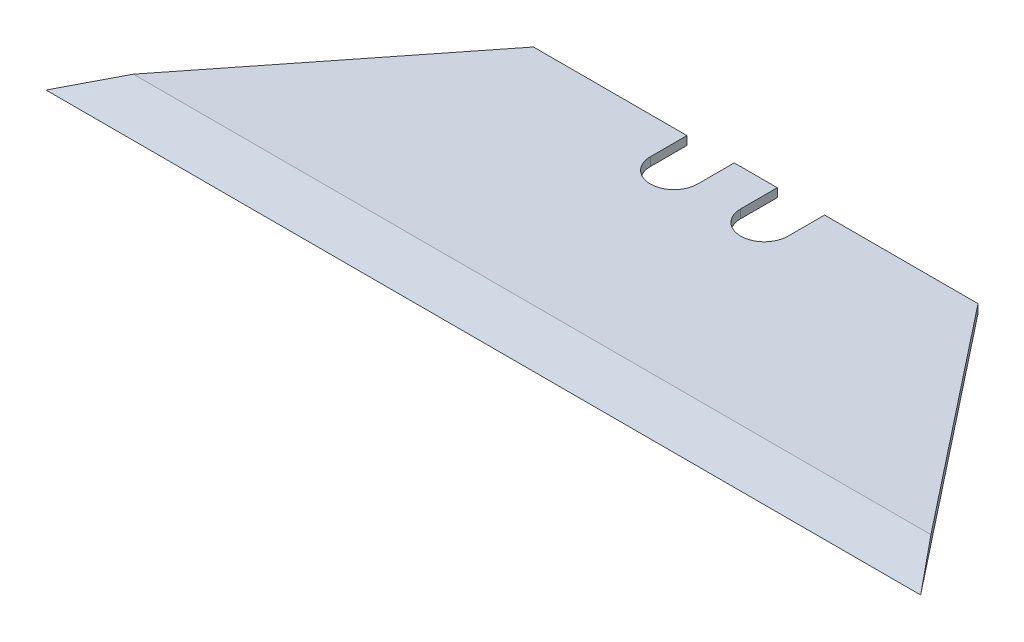
ISO-10303-21;
HEADER;
FILE_DESCRIPTION(('STEP AP214'),'2;1');
FILE_NAME('part.step','',(''),(''),'','','');
FILE_SCHEMA(('AUTOMOTIVE_DESIGN { 1 0 10303 214 1 1 1 1 }'));
ENDSEC;
DATA;
#1=APPLICATION_CONTEXT('core data for automotive mechanical design processes');
#2=APPLICATION_PROTOCOL_DEFINITION('international standard','automotive_design',2000,#1);
#3=PRODUCT_CONTEXT('',#1,'mechanical');
#4=PRODUCT('Part','Part','',(#3));
#5=PRODUCT_RELATED_PRODUCT_CATEGORY('part','',(#4));
#6=PRODUCT_DEFINITION_FORMATION('','',#4);
#7=PRODUCT_DEFINITION_CONTEXT('part definition',#1,'design');
#8=PRODUCT_DEFINITION('design','',#6,#7);
#9=PRODUCT_DEFINITION_SHAPE('','',#8);
#10=(LENGTH_UNIT() NAMED_UNIT(*) SI_UNIT(.MILLI.,.METRE.));
#11=(NAMED_UNIT(*) PLANE_ANGLE_UNIT() SI_UNIT($,.RADIAN.));
#12=(NAMED_UNIT(*) SI_UNIT($,.STERADIAN.) SOLID_ANGLE_UNIT());
#13=UNCERTAINTY_MEASURE_WITH_UNIT(LENGTH_MEASURE(1.E-05),#10,'distance_accuracy_value','');
#14=(GEOMETRIC_REPRESENTATION_CONTEXT(3) GLOBAL_UNCERTAINTY_ASSIGNED_CONTEXT((#13)) GLOBAL_UNIT_ASSIGNED_CONTEXT((#10,
#11,#12)) REPRESENTATION_CONTEXT('',''));
#15=CARTESIAN_POINT('',(0.,0.,0.));
#16=DIRECTION('',(0.,0.,1.));
#17=DIRECTION('',(1.,0.,0.));
#18=AXIS2_PLACEMENT_3D('',#15,#16,#17);
#19=CARTESIAN_POINT('',(46.,0.6,-19.));
#20=DIRECTION('',(0.,0.,1.));
#21=DIRECTION('',(1.,0.,0.));
#22=AXIS2_PLACEMENT_3D('',#19,#20,#21);
#23=PLANE('',#22);
#24=DIRECTION('',(-1.,0.,0.));
#25=VECTOR('',#24,1.);
#26=CARTESIAN_POINT('',(46.,0.6,-19.));
#27=LINE('',#26,#25);
#28=CARTESIAN_POINT('',(25.7,0.6,-19.));
#29=VERTEX_POINT('',#28);
#30=CARTESIAN_POINT('',(15.,0.6,-19.));
#31=VERTEX_POINT('',#30);
#32=EDGE_CURVE('E142',#29,#31,#27,.T.);
#33=ORIENTED_EDGE('',*,*,#32,.F.);
#34=DIRECTION('',(0.,-1.,0.));
#35=VECTOR('',#34,1.);
#36=CARTESIAN_POINT('',(25.7,0.6,-19.));
#37=LINE('',#36,#35);
#38=CARTESIAN_POINT('',(25.7,0.,-19.));
#39=VERTEX_POINT('',#38);
#40=EDGE_CURVE('E181',#29,#39,#37,.T.);
#41=ORIENTED_EDGE('',*,*,#40,.T.);
#42=DIRECTION('',(-1.,0.,0.));
#43=VECTOR('',#42,1.);
#44=CARTESIAN_POINT('',(46.,0.,-19.));
#45=LINE('',#44,#43);
#46=CARTESIAN_POINT('',(15.,0.,-19.));
#47=VERTEX_POINT('',#46);
#48=EDGE_CURVE('E158',#39,#47,#45,.T.);
#49=ORIENTED_EDGE('',*,*,#48,.T.);
#50=DIRECTION('',(0.,-1.,0.));
#51=VECTOR('',#50,1.);
#52=CARTESIAN_POINT('',(15.,0.6,-19.));
#53=LINE('',#52,#51);
#54=EDGE_CURVE('E151',#31,#47,#53,.T.);
#55=ORIENTED_EDGE('',*,*,#54,.F.);
#56=EDGE_LOOP('',(#33,#41,#49,#55));
#57=FACE_BOUND('',#56,.T.);
#58=ADVANCED_FACE('F40',(#57),#23,.F.);
#59=CARTESIAN_POINT('',(32.,0.,-19.));
#60=VERTEX_POINT('',#59);
#61=CARTESIAN_POINT('',(29.,0.,-19.));
#62=VERTEX_POINT('',#61);
#63=EDGE_CURVE('E161',#60,#62,#45,.T.);
#64=ORIENTED_EDGE('',*,*,#63,.T.);
#65=DIRECTION('',(0.,1.,0.));
#66=VECTOR('',#65,1.);
#67=CARTESIAN_POINT('',(29.,0.6,-19.));
#68=LINE('',#67,#66);
#69=CARTESIAN_POINT('',(29.,0.6,-19.));
#70=VERTEX_POINT('',#69);
#71=EDGE_CURVE('E60',#62,#70,#68,.T.);
#72=ORIENTED_EDGE('',*,*,#71,.T.);
#73=CARTESIAN_POINT('',(32.,0.6,-19.));
#74=VERTEX_POINT('',#73);
#75=EDGE_CURVE('E144',#74,#70,#27,.T.);
#76=ORIENTED_EDGE('',*,*,#75,.F.);
#77=DIRECTION('',(0.,-1.,0.));
#78=VECTOR('',#77,1.);
#79=CARTESIAN_POINT('',(32.,0.6,-19.));
#80=LINE('',#79,#78);
#81=EDGE_CURVE('E176',#74,#60,#80,.T.);
#82=ORIENTED_EDGE('',*,*,#81,.T.);
#83=EDGE_LOOP('',(#64,#72,#76,#82));
#84=FACE_BOUND('',#83,.T.);
#85=ADVANCED_FACE('F213',(#84),#23,.F.);
#86=CARTESIAN_POINT('',(15.,0.6,-19.));
#87=DIRECTION('',(0.784882765533426,0.,0.619644288579021));
#88=DIRECTION('',(0.619644288579021,0.,-0.784882765533426));
#89=AXIS2_PLACEMENT_3D('',#86,#87,#88);
#90=PLANE('',#89);
#91=DIRECTION('',(-0.619644288579021,0.,0.784882765533426));
#92=VECTOR('',#91,1.);
#93=CARTESIAN_POINT('',(15.,0.,-19.));
#94=LINE('',#93,#92);
#95=CARTESIAN_POINT('',(0.,0.,0.));
#96=VERTEX_POINT('',#95);
#97=EDGE_CURVE('E152',#47,#96,#94,.T.);
#98=ORIENTED_EDGE('',*,*,#97,.T.);
#99=DIRECTION('',(-0.613794030670308,-0.137089367726302,0.777472438849057));
#100=VECTOR('',#99,1.);
#101=CARTESIAN_POINT('',(1.67431521665146,0.373954132748098,-2.12079927442518));
#102=LINE('',#101,#100);
#103=CARTESIAN_POINT('',(2.68639665139785,0.6,-3.40276909177061));
#104=VERTEX_POINT('',#103);
#105=EDGE_CURVE('E126',#96,#104,#102,.F.);
#106=ORIENTED_EDGE('',*,*,#105,.T.);
#107=DIRECTION('',(-0.619644288579021,0.,0.784882765533426));
#108=VECTOR('',#107,1.);
#109=CARTESIAN_POINT('',(15.,0.6,-19.));
#110=LINE('',#109,#108);
#111=EDGE_CURVE('E136',#31,#104,#110,.T.);
#112=ORIENTED_EDGE('',*,*,#111,.F.);
#113=ORIENTED_EDGE('',*,*,#54,.T.);
#114=EDGE_LOOP('',(#98,#106,#112,#113));
#115=FACE_BOUND('',#114,.T.);
#116=ADVANCED_FACE('F254',(#115),#90,.F.);
#117=CARTESIAN_POINT('',(61.,0.6,0.));
#118=DIRECTION('',(-0.784882765533426,0.,0.619644288579021));
#119=DIRECTION('',(0.619644288579021,0.,0.784882765533426));
#120=AXIS2_PLACEMENT_3D('',#117,#118,#119);
#121=PLANE('',#120);
#122=DIRECTION('',(-0.619644288579021,0.,-0.784882765533426));
#123=VECTOR('',#122,1.);
#124=CARTESIAN_POINT('',(61.,0.6,0.));
#125=LINE('',#124,#123);
#126=CARTESIAN_POINT('',(58.3136033486022,0.6,-3.40276909177061));
#127=VERTEX_POINT('',#126);
#128=CARTESIAN_POINT('',(46.,0.6,-19.));
#129=VERTEX_POINT('',#128);
#130=EDGE_CURVE('E133',#127,#129,#125,.T.);
#131=ORIENTED_EDGE('',*,*,#130,.F.);
#132=DIRECTION('',(-0.613794030670308,0.137089367726302,-0.777472438849057));
#133=VECTOR('',#132,1.);
#134=CARTESIAN_POINT('',(36.3443549460719,5.50677690305311,-31.2304837349756));
#135=LINE('',#134,#133);
#136=CARTESIAN_POINT('',(61.,0.,0.));
#137=VERTEX_POINT('',#136);
#138=EDGE_CURVE('E118',#127,#137,#135,.F.);
#139=ORIENTED_EDGE('',*,*,#138,.T.);
#140=DIRECTION('',(-0.619644288579021,0.,-0.784882765533426));
#141=VECTOR('',#140,1.);
#142=CARTESIAN_POINT('',(61.,0.,0.));
#143=LINE('',#142,#141);
#144=CARTESIAN_POINT('',(46.,0.,-19.));
#145=VERTEX_POINT('',#144);
#146=EDGE_CURVE('E156',#137,#145,#143,.T.);
#147=ORIENTED_EDGE('',*,*,#146,.T.);
#148=DIRECTION('',(0.,-1.,0.));
#149=VECTOR('',#148,1.);
#150=CARTESIAN_POINT('',(46.,0.6,-19.));
#151=LINE('',#150,#149);
#152=EDGE_CURVE('E137',#129,#145,#151,.T.);
#153=ORIENTED_EDGE('',*,*,#152,.F.);
#154=EDGE_LOOP('',(#131,#139,#147,#153));
#155=FACE_BOUND('',#154,.T.);
#156=ADVANCED_FACE('F139',(#155),#121,.F.);
#157=CARTESIAN_POINT('',(35.3,0.,-19.));
#158=VERTEX_POINT('',#157);
#159=EDGE_CURVE('E147',#145,#158,#45,.T.);
#160=ORIENTED_EDGE('',*,*,#159,.T.);
#161=DIRECTION('',(0.,1.,0.));
#162=VECTOR('',#161,1.);
#163=CARTESIAN_POINT('',(35.3,0.6,-19.));
#164=LINE('',#163,#162);
#165=CARTESIAN_POINT('',(35.3,0.6,-19.));
#166=VERTEX_POINT('',#165);
#167=EDGE_CURVE('E171',#158,#166,#164,.T.);
#168=ORIENTED_EDGE('',*,*,#167,.T.);
#169=EDGE_CURVE('E146',#129,#166,#27,.T.);
#170=ORIENTED_EDGE('',*,*,#169,.F.);
#171=ORIENTED_EDGE('',*,*,#152,.T.);
#172=EDGE_LOOP('',(#160,#168,#170,#171));
#173=FACE_BOUND('',#172,.T.);
#174=ADVANCED_FACE('F252',(#173),#23,.F.);
#175=CARTESIAN_POINT('',(0.,0.6,0.));
#176=DIRECTION('',(0.,-1.,0.));
#177=DIRECTION('',(0.,0.,-1.));
#178=AXIS2_PLACEMENT_3D('',#175,#176,#177);
#179=PLANE('',#178);
#180=CARTESIAN_POINT('',(27.35,0.6,-16.4508982663448));
#181=DIRECTION('',(0.,1.,0.));
#182=DIRECTION('',(0.,0.,1.));
#183=AXIS2_PLACEMENT_3D('',#180,#181,#182);
#184=CIRCLE('',#183,1.65000000000001);
#185=CARTESIAN_POINT('',(25.7,0.6,-16.4508982663448));
#186=VERTEX_POINT('',#185);
#187=CARTESIAN_POINT('',(29.,0.6,-16.4508982663448));
#188=VERTEX_POINT('',#187);
#189=EDGE_CURVE('E45',#186,#188,#184,.T.);
#190=ORIENTED_EDGE('',*,*,#189,.F.);
#191=DIRECTION('',(0.,0.,-1.));
#192=VECTOR('',#191,1.);
#193=CARTESIAN_POINT('',(25.7,0.6,0.));
#194=LINE('',#193,#192);
#195=EDGE_CURVE('E84',#186,#29,#194,.T.);
#196=ORIENTED_EDGE('',*,*,#195,.T.);
#197=ORIENTED_EDGE('',*,*,#32,.T.);
#198=ORIENTED_EDGE('',*,*,#111,.T.);
#199=DIRECTION('',(1.,0.,0.));
#200=VECTOR('',#199,1.);
#201=CARTESIAN_POINT('',(0.,0.6,-3.40276909177061));
#202=LINE('',#201,#200);
#203=EDGE_CURVE('E121',#104,#127,#202,.T.);
#204=ORIENTED_EDGE('',*,*,#203,.T.);
#205=ORIENTED_EDGE('',*,*,#130,.T.);
#206=ORIENTED_EDGE('',*,*,#169,.T.);
#207=DIRECTION('',(0.,0.,1.));
#208=VECTOR('',#207,1.);
#209=CARTESIAN_POINT('',(35.3,0.6,0.));
#210=LINE('',#209,#208);
#211=CARTESIAN_POINT('',(35.3,0.6,-16.4508982663448));
#212=VERTEX_POINT('',#211);
#213=EDGE_CURVE('E168',#166,#212,#210,.T.);
#214=ORIENTED_EDGE('',*,*,#213,.T.);
#215=CARTESIAN_POINT('',(33.65,0.6,-16.4508982663448));
#216=DIRECTION('',(0.,1.,0.));
#217=DIRECTION('',(0.,0.,1.));
#218=AXIS2_PLACEMENT_3D('',#215,#216,#217);
#219=CIRCLE('',#218,1.64999999999999);
#220=CARTESIAN_POINT('',(32.,0.6,-16.4508982663448));
#221=VERTEX_POINT('',#220);
#222=EDGE_CURVE('E180',#221,#212,#219,.T.);
#223=ORIENTED_EDGE('',*,*,#222,.F.);
#224=DIRECTION('',(0.,0.,-1.));
#225=VECTOR('',#224,1.);
#226=CARTESIAN_POINT('',(32.,0.6,0.));
#227=LINE('',#226,#225);
#228=EDGE_CURVE('E173',#221,#74,#227,.T.);
#229=ORIENTED_EDGE('',*,*,#228,.T.);
#230=ORIENTED_EDGE('',*,*,#75,.T.);
#231=DIRECTION('',(0.,0.,1.));
#232=VECTOR('',#231,1.);
#233=CARTESIAN_POINT('',(29.,0.6,0.));
#234=LINE('',#233,#232);
#235=EDGE_CURVE('E177',#70,#188,#234,.T.);
#236=ORIENTED_EDGE('',*,*,#235,.T.);
#237=EDGE_LOOP('',(#190,#196,#197,#198,#204,#205,#206,#214,#223,#229,#230,#236));
#238=FACE_BOUND('',#237,.T.);
#239=ADVANCED_FACE('F131',(#238),#179,.F.);
#240=CARTESIAN_POINT('',(0.,0.,0.));
#241=DIRECTION('',(0.,-1.,0.));
#242=DIRECTION('',(0.,0.,-1.));
#243=AXIS2_PLACEMENT_3D('',#240,#241,#242);
#244=PLANE('',#243);
#245=DIRECTION('',(0.,0.,-1.));
#246=VECTOR('',#245,1.);
#247=CARTESIAN_POINT('',(25.7,0.,0.));
#248=LINE('',#247,#246);
#249=CARTESIAN_POINT('',(25.7,0.,-16.4508982663448));
#250=VERTEX_POINT('',#249);
#251=EDGE_CURVE('E11',#250,#39,#248,.T.);
#252=ORIENTED_EDGE('',*,*,#251,.F.);
#253=CARTESIAN_POINT('',(27.35,0.,-16.4508982663448));
#254=DIRECTION('',(0.,1.,0.));
#255=DIRECTION('',(0.,0.,1.));
#256=AXIS2_PLACEMENT_3D('',#253,#254,#255);
#257=CIRCLE('',#256,1.65000000000001);
#258=CARTESIAN_POINT('',(29.,0.,-16.4508982663448));
#259=VERTEX_POINT('',#258);
#260=EDGE_CURVE('E227',#250,#259,#257,.T.);
#261=ORIENTED_EDGE('',*,*,#260,.T.);
#262=DIRECTION('',(0.,0.,-1.));
#263=VECTOR('',#262,1.);
#264=CARTESIAN_POINT('',(29.,0.,-16.4508982663448));
#265=LINE('',#264,#263);
#266=EDGE_CURVE('E209',#259,#62,#265,.T.);
#267=ORIENTED_EDGE('',*,*,#266,.T.);
#268=ORIENTED_EDGE('',*,*,#63,.F.);
#269=DIRECTION('',(0.,0.,-1.));
#270=VECTOR('',#269,1.);
#271=CARTESIAN_POINT('',(32.,0.,0.));
#272=LINE('',#271,#270);
#273=CARTESIAN_POINT('',(32.,0.,-16.4508982663448));
#274=VERTEX_POINT('',#273);
#275=EDGE_CURVE('E51',#274,#60,#272,.T.);
#276=ORIENTED_EDGE('',*,*,#275,.F.);
#277=CARTESIAN_POINT('',(33.65,0.,-16.4508982663448));
#278=DIRECTION('',(0.,1.,0.));
#279=DIRECTION('',(0.,0.,1.));
#280=AXIS2_PLACEMENT_3D('',#277,#278,#279);
#281=CIRCLE('',#280,1.64999999999999);
#282=CARTESIAN_POINT('',(35.3,0.,-16.4508982663448));
#283=VERTEX_POINT('',#282);
#284=EDGE_CURVE('E229',#274,#283,#281,.T.);
#285=ORIENTED_EDGE('',*,*,#284,.T.);
#286=DIRECTION('',(0.,0.,-1.));
#287=VECTOR('',#286,1.);
#288=CARTESIAN_POINT('',(35.3,0.,-16.4508982663448));
#289=LINE('',#288,#287);
#290=EDGE_CURVE('E240',#283,#158,#289,.T.);
#291=ORIENTED_EDGE('',*,*,#290,.T.);
#292=ORIENTED_EDGE('',*,*,#159,.F.);
#293=ORIENTED_EDGE('',*,*,#146,.F.);
#294=DIRECTION('',(1.,0.,0.));
#295=VECTOR('',#294,1.);
#296=CARTESIAN_POINT('',(0.,0.,0.));
#297=LINE('',#296,#295);
#298=EDGE_CURVE('E122',#96,#137,#297,.T.);
#299=ORIENTED_EDGE('',*,*,#298,.F.);
#300=ORIENTED_EDGE('',*,*,#97,.F.);
#301=ORIENTED_EDGE('',*,*,#48,.F.);
#302=EDGE_LOOP('',(#252,#261,#267,#268,#276,#285,#291,#292,#293,#299,#300,#301));
#303=FACE_BOUND('',#302,.T.);
#304=ADVANCED_FACE('F231',(#303),#244,.T.);
#305=CARTESIAN_POINT('',(0.,0.6,-3.40276909177061));
#306=DIRECTION('',(0.,-0.984807753012208,-0.173648177666931));
#307=DIRECTION('',(1.,0.,0.));
#308=AXIS2_PLACEMENT_3D('',#305,#306,#307);
#309=PLANE('',#308);
#310=ORIENTED_EDGE('',*,*,#105,.F.);
#311=ORIENTED_EDGE('',*,*,#298,.T.);
#312=ORIENTED_EDGE('',*,*,#138,.F.);
#313=ORIENTED_EDGE('',*,*,#203,.F.);
#314=EDGE_LOOP('',(#310,#311,#312,#313));
#315=FACE_BOUND('',#314,.T.);
#316=ADVANCED_FACE('F43',(#315),#309,.F.);
#317=CARTESIAN_POINT('',(33.65,0.,-16.4508982663448));
#318=DIRECTION('',(0.,1.,0.));
#319=DIRECTION('',(0.,0.,1.));
#320=AXIS2_PLACEMENT_3D('',#317,#318,#319);
#321=CYLINDRICAL_SURFACE('',#320,1.64999999999999);
#322=DIRECTION('',(0.,1.,0.));
#323=VECTOR('',#322,1.);
#324=CARTESIAN_POINT('',(35.3,0.,-16.4508982663448));
#325=LINE('',#324,#323);
#326=EDGE_CURVE('E238',#283,#212,#325,.T.);
#327=ORIENTED_EDGE('',*,*,#326,.F.);
#328=ORIENTED_EDGE('',*,*,#284,.F.);
#329=DIRECTION('',(0.,1.,0.));
#330=VECTOR('',#329,1.);
#331=CARTESIAN_POINT('',(32.,0.,-16.4508982663448));
#332=LINE('',#331,#330);
#333=EDGE_CURVE('E241',#274,#221,#332,.T.);
#334=ORIENTED_EDGE('',*,*,#333,.T.);
#335=ORIENTED_EDGE('',*,*,#222,.T.);
#336=EDGE_LOOP('',(#327,#328,#334,#335));
#337=FACE_BOUND('',#336,.T.);
#338=ADVANCED_FACE('F247',(#337),#321,.F.);
#339=CARTESIAN_POINT('',(32.,0.,-16.4508982663448));
#340=DIRECTION('',(-1.,0.,0.));
#341=DIRECTION('',(0.,0.,1.));
#342=AXIS2_PLACEMENT_3D('',#339,#340,#341);
#343=PLANE('',#342);
#344=ORIENTED_EDGE('',*,*,#228,.F.);
#345=ORIENTED_EDGE('',*,*,#333,.F.);
#346=ORIENTED_EDGE('',*,*,#275,.T.);
#347=ORIENTED_EDGE('',*,*,#81,.F.);
#348=EDGE_LOOP('',(#344,#345,#346,#347));
#349=FACE_BOUND('',#348,.T.);
#350=ADVANCED_FACE('F333',(#349),#343,.F.);
#351=CARTESIAN_POINT('',(35.3,0.,-16.4508982663448));
#352=DIRECTION('',(1.,0.,0.));
#353=DIRECTION('',(0.,0.,-1.));
#354=AXIS2_PLACEMENT_3D('',#351,#352,#353);
#355=PLANE('',#354);
#356=ORIENTED_EDGE('',*,*,#290,.F.);
#357=ORIENTED_EDGE('',*,*,#326,.T.);
#358=ORIENTED_EDGE('',*,*,#213,.F.);
#359=ORIENTED_EDGE('',*,*,#167,.F.);
#360=EDGE_LOOP('',(#356,#357,#358,#359));
#361=FACE_BOUND('',#360,.T.);
#362=ADVANCED_FACE('F249',(#361),#355,.F.);
#363=CARTESIAN_POINT('',(27.35,0.,-16.4508982663448));
#364=DIRECTION('',(0.,1.,0.));
#365=DIRECTION('',(0.,0.,1.));
#366=AXIS2_PLACEMENT_3D('',#363,#364,#365);
#367=CYLINDRICAL_SURFACE('',#366,1.65000000000001);
#368=DIRECTION('',(0.,1.,0.));
#369=VECTOR('',#368,1.);
#370=CARTESIAN_POINT('',(29.,0.,-16.4508982663448));
#371=LINE('',#370,#369);
#372=EDGE_CURVE('E207',#259,#188,#371,.T.);
#373=ORIENTED_EDGE('',*,*,#372,.F.);
#374=ORIENTED_EDGE('',*,*,#260,.F.);
#375=DIRECTION('',(0.,1.,0.));
#376=VECTOR('',#375,1.);
#377=CARTESIAN_POINT('',(25.7,0.,-16.4508982663448));
#378=LINE('',#377,#376);
#379=EDGE_CURVE('E172',#250,#186,#378,.T.);
#380=ORIENTED_EDGE('',*,*,#379,.T.);
#381=ORIENTED_EDGE('',*,*,#189,.T.);
#382=EDGE_LOOP('',(#373,#374,#380,#381));
#383=FACE_BOUND('',#382,.T.);
#384=ADVANCED_FACE('F204',(#383),#367,.F.);
#385=CARTESIAN_POINT('',(25.7,0.,-16.4508982663448));
#386=DIRECTION('',(-1.,0.,0.));
#387=DIRECTION('',(0.,0.,1.));
#388=AXIS2_PLACEMENT_3D('',#385,#386,#387);
#389=PLANE('',#388);
#390=ORIENTED_EDGE('',*,*,#195,.F.);
#391=ORIENTED_EDGE('',*,*,#379,.F.);
#392=ORIENTED_EDGE('',*,*,#251,.T.);
#393=ORIENTED_EDGE('',*,*,#40,.F.);
#394=EDGE_LOOP('',(#390,#391,#392,#393));
#395=FACE_BOUND('',#394,.T.);
#396=ADVANCED_FACE('F225',(#395),#389,.F.);
#397=CARTESIAN_POINT('',(29.,0.,-16.4508982663448));
#398=DIRECTION('',(1.,0.,0.));
#399=DIRECTION('',(0.,0.,-1.));
#400=AXIS2_PLACEMENT_3D('',#397,#398,#399);
#401=PLANE('',#400);
#402=ORIENTED_EDGE('',*,*,#266,.F.);
#403=ORIENTED_EDGE('',*,*,#372,.T.);
#404=ORIENTED_EDGE('',*,*,#235,.F.);
#405=ORIENTED_EDGE('',*,*,#71,.F.);
#406=EDGE_LOOP('',(#402,#403,#404,#405));
#407=FACE_BOUND('',#406,.T.);
#408=ADVANCED_FACE('F208',(#407),#401,.F.);
#409=CLOSED_SHELL('',(#58,#85,#116,#156,#174,#239,#304,#316,#338,#350,#362,#384,#396,#408));
#410=MANIFOLD_SOLID_BREP('B2',#409);
#411=ADVANCED_BREP_SHAPE_REPRESENTATION('',(#18,#410),#14);
#412=SHAPE_DEFINITION_REPRESENTATION(#9,#411);
ENDSEC;
END-ISO-10303-21;
